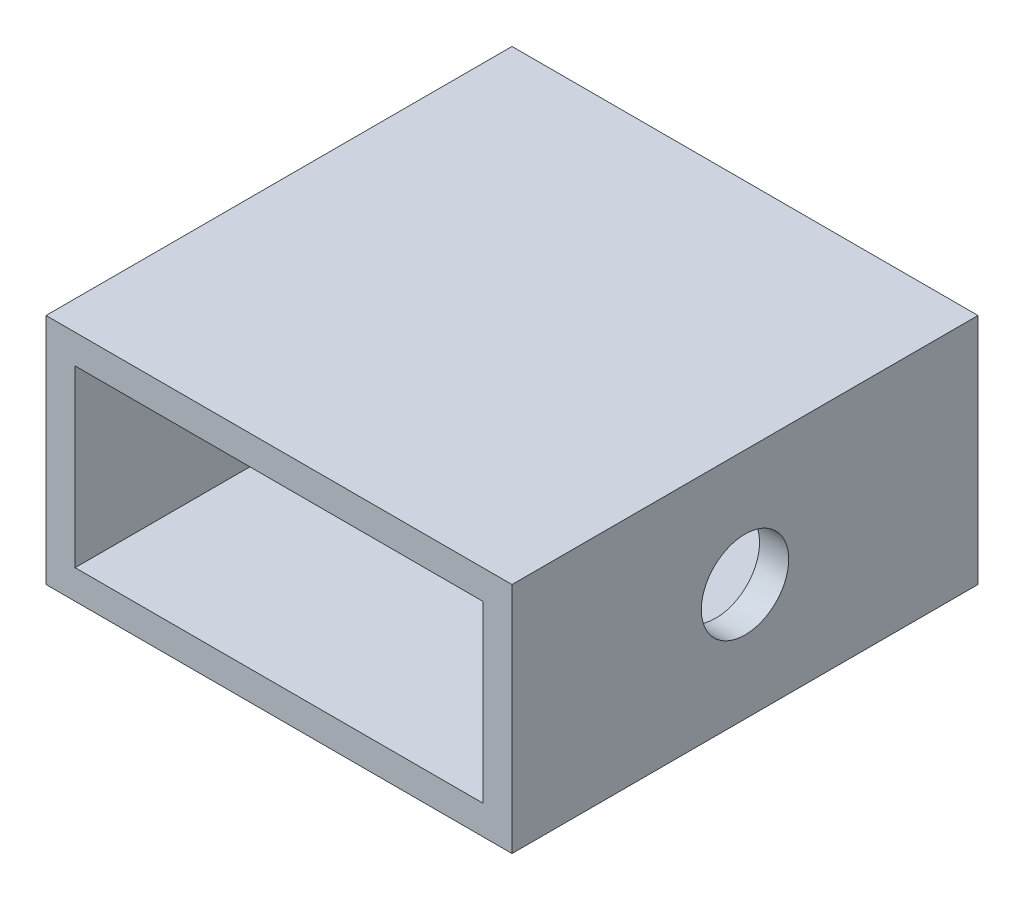
ISO-10303-21;
HEADER;
FILE_DESCRIPTION(('STEP AP214'),'2;1');
FILE_NAME('part.step','',(''),(''),'','','');
FILE_SCHEMA(('AUTOMOTIVE_DESIGN { 1 0 10303 214 1 1 1 1 }'));
ENDSEC;
DATA;
#1=APPLICATION_CONTEXT('core data for automotive mechanical design processes');
#2=APPLICATION_PROTOCOL_DEFINITION('international standard','automotive_design',2000,#1);
#3=PRODUCT_CONTEXT('',#1,'mechanical');
#4=PRODUCT('Part','Part','',(#3));
#5=PRODUCT_RELATED_PRODUCT_CATEGORY('part','',(#4));
#6=PRODUCT_DEFINITION_FORMATION('','',#4);
#7=PRODUCT_DEFINITION_CONTEXT('part definition',#1,'design');
#8=PRODUCT_DEFINITION('design','',#6,#7);
#9=PRODUCT_DEFINITION_SHAPE('','',#8);
#10=(LENGTH_UNIT() NAMED_UNIT(*) SI_UNIT(.MILLI.,.METRE.));
#11=(NAMED_UNIT(*) PLANE_ANGLE_UNIT() SI_UNIT($,.RADIAN.));
#12=(NAMED_UNIT(*) SI_UNIT($,.STERADIAN.) SOLID_ANGLE_UNIT());
#13=UNCERTAINTY_MEASURE_WITH_UNIT(LENGTH_MEASURE(1.E-05),#10,'distance_accuracy_value','');
#14=(GEOMETRIC_REPRESENTATION_CONTEXT(3) GLOBAL_UNCERTAINTY_ASSIGNED_CONTEXT((#13)) GLOBAL_UNIT_ASSIGNED_CONTEXT((#10,
#11,#12)) REPRESENTATION_CONTEXT('',''));
#15=CARTESIAN_POINT('',(0.,0.,0.));
#16=DIRECTION('',(0.,0.,1.));
#17=DIRECTION('',(1.,0.,0.));
#18=AXIS2_PLACEMENT_3D('',#15,#16,#17);
#19=CARTESIAN_POINT('',(0.,0.,50.8));
#20=DIRECTION('',(0.,0.,-1.));
#21=DIRECTION('',(-1.,0.,0.));
#22=AXIS2_PLACEMENT_3D('',#19,#20,#21);
#23=PLANE('',#22);
#24=DIRECTION('',(0.,1.,0.));
#25=VECTOR('',#24,1.);
#26=CARTESIAN_POINT('',(25.4,-12.7,50.8));
#27=LINE('',#26,#25);
#28=CARTESIAN_POINT('',(25.4,-12.7,50.8));
#29=VERTEX_POINT('',#28);
#30=CARTESIAN_POINT('',(25.4,12.7,50.8));
#31=VERTEX_POINT('',#30);
#32=EDGE_CURVE('E145',#29,#31,#27,.T.);
#33=ORIENTED_EDGE('',*,*,#32,.T.);
#34=DIRECTION('',(-1.,0.,0.));
#35=VECTOR('',#34,1.);
#36=CARTESIAN_POINT('',(-25.4,12.7,50.8));
#37=LINE('',#36,#35);
#38=CARTESIAN_POINT('',(-25.4,12.7,50.8));
#39=VERTEX_POINT('',#38);
#40=EDGE_CURVE('E148',#31,#39,#37,.T.);
#41=ORIENTED_EDGE('',*,*,#40,.T.);
#42=DIRECTION('',(0.,-1.,0.));
#43=VECTOR('',#42,1.);
#44=CARTESIAN_POINT('',(-25.4,-12.7,50.8));
#45=LINE('',#44,#43);
#46=CARTESIAN_POINT('',(-25.4,-12.7,50.8));
#47=VERTEX_POINT('',#46);
#48=EDGE_CURVE('E151',#39,#47,#45,.T.);
#49=ORIENTED_EDGE('',*,*,#48,.T.);
#50=DIRECTION('',(1.,0.,0.));
#51=VECTOR('',#50,1.);
#52=CARTESIAN_POINT('',(-25.4,-12.7,50.8));
#53=LINE('',#52,#51);
#54=EDGE_CURVE('E153',#47,#29,#53,.T.);
#55=ORIENTED_EDGE('',*,*,#54,.T.);
#56=EDGE_LOOP('',(#33,#41,#49,#55));
#57=FACE_BOUND('',#56,.T.);
#58=DIRECTION('',(0.,-1.,0.));
#59=VECTOR('',#58,1.);
#60=CARTESIAN_POINT('',(-22.225,-9.525,50.8));
#61=LINE('',#60,#59);
#62=CARTESIAN_POINT('',(-22.225,9.525,50.8));
#63=VERTEX_POINT('',#62);
#64=CARTESIAN_POINT('',(-22.225,-9.525,50.8));
#65=VERTEX_POINT('',#64);
#66=EDGE_CURVE('E103',#63,#65,#61,.T.);
#67=ORIENTED_EDGE('',*,*,#66,.F.);
#68=DIRECTION('',(-1.,0.,0.));
#69=VECTOR('',#68,1.);
#70=CARTESIAN_POINT('',(-22.225,9.525,50.8));
#71=LINE('',#70,#69);
#72=CARTESIAN_POINT('',(22.225,9.525,50.8));
#73=VERTEX_POINT('',#72);
#74=EDGE_CURVE('E126',#73,#63,#71,.T.);
#75=ORIENTED_EDGE('',*,*,#74,.F.);
#76=DIRECTION('',(0.,1.,0.));
#77=VECTOR('',#76,1.);
#78=CARTESIAN_POINT('',(22.225,-9.525,50.8));
#79=LINE('',#78,#77);
#80=CARTESIAN_POINT('',(22.225,-9.525,50.8));
#81=VERTEX_POINT('',#80);
#82=EDGE_CURVE('E124',#81,#73,#79,.T.);
#83=ORIENTED_EDGE('',*,*,#82,.F.);
#84=DIRECTION('',(1.,0.,0.));
#85=VECTOR('',#84,1.);
#86=CARTESIAN_POINT('',(-22.225,-9.525,50.8));
#87=LINE('',#86,#85);
#88=EDGE_CURVE('E111',#65,#81,#87,.T.);
#89=ORIENTED_EDGE('',*,*,#88,.F.);
#90=EDGE_LOOP('',(#67,#75,#83,#89));
#91=FACE_BOUND('',#90,.T.);
#92=ADVANCED_FACE('F36',(#57,#91),#23,.F.);
#93=CARTESIAN_POINT('',(0.,0.,0.));
#94=DIRECTION('',(0.,0.,-1.));
#95=DIRECTION('',(-1.,0.,0.));
#96=AXIS2_PLACEMENT_3D('',#93,#94,#95);
#97=PLANE('',#96);
#98=DIRECTION('',(0.,1.,0.));
#99=VECTOR('',#98,1.);
#100=CARTESIAN_POINT('',(25.4,-12.7,0.));
#101=LINE('',#100,#99);
#102=CARTESIAN_POINT('',(25.4,-12.7,0.));
#103=VERTEX_POINT('',#102);
#104=CARTESIAN_POINT('',(25.4,12.7,0.));
#105=VERTEX_POINT('',#104);
#106=EDGE_CURVE('E120',#103,#105,#101,.T.);
#107=ORIENTED_EDGE('',*,*,#106,.F.);
#108=DIRECTION('',(1.,0.,0.));
#109=VECTOR('',#108,1.);
#110=CARTESIAN_POINT('',(-25.4,-12.7,0.));
#111=LINE('',#110,#109);
#112=CARTESIAN_POINT('',(-25.4,-12.7,0.));
#113=VERTEX_POINT('',#112);
#114=EDGE_CURVE('E149',#113,#103,#111,.T.);
#115=ORIENTED_EDGE('',*,*,#114,.F.);
#116=DIRECTION('',(0.,-1.,0.));
#117=VECTOR('',#116,1.);
#118=CARTESIAN_POINT('',(-25.4,-12.7,0.));
#119=LINE('',#118,#117);
#120=CARTESIAN_POINT('',(-25.4,12.7,0.));
#121=VERTEX_POINT('',#120);
#122=EDGE_CURVE('E160',#121,#113,#119,.T.);
#123=ORIENTED_EDGE('',*,*,#122,.F.);
#124=DIRECTION('',(-1.,0.,0.));
#125=VECTOR('',#124,1.);
#126=CARTESIAN_POINT('',(-25.4,12.7,0.));
#127=LINE('',#126,#125);
#128=EDGE_CURVE('E158',#105,#121,#127,.T.);
#129=ORIENTED_EDGE('',*,*,#128,.F.);
#130=EDGE_LOOP('',(#107,#115,#123,#129));
#131=FACE_BOUND('',#130,.T.);
#132=DIRECTION('',(-1.,0.,0.));
#133=VECTOR('',#132,1.);
#134=CARTESIAN_POINT('',(-22.225,9.525,0.));
#135=LINE('',#134,#133);
#136=CARTESIAN_POINT('',(22.225,9.525,0.));
#137=VERTEX_POINT('',#136);
#138=CARTESIAN_POINT('',(-22.225,9.525,0.));
#139=VERTEX_POINT('',#138);
#140=EDGE_CURVE('E112',#137,#139,#135,.T.);
#141=ORIENTED_EDGE('',*,*,#140,.T.);
#142=DIRECTION('',(0.,-1.,0.));
#143=VECTOR('',#142,1.);
#144=CARTESIAN_POINT('',(-22.225,-9.525,0.));
#145=LINE('',#144,#143);
#146=CARTESIAN_POINT('',(-22.225,-9.525,0.));
#147=VERTEX_POINT('',#146);
#148=EDGE_CURVE('E60',#139,#147,#145,.T.);
#149=ORIENTED_EDGE('',*,*,#148,.T.);
#150=DIRECTION('',(1.,0.,0.));
#151=VECTOR('',#150,1.);
#152=CARTESIAN_POINT('',(-22.225,-9.525,0.));
#153=LINE('',#152,#151);
#154=CARTESIAN_POINT('',(22.225,-9.525,0.));
#155=VERTEX_POINT('',#154);
#156=EDGE_CURVE('E118',#147,#155,#153,.T.);
#157=ORIENTED_EDGE('',*,*,#156,.T.);
#158=DIRECTION('',(0.,1.,0.));
#159=VECTOR('',#158,1.);
#160=CARTESIAN_POINT('',(22.225,-9.525,0.));
#161=LINE('',#160,#159);
#162=EDGE_CURVE('E137',#155,#137,#161,.T.);
#163=ORIENTED_EDGE('',*,*,#162,.T.);
#164=EDGE_LOOP('',(#141,#149,#157,#163));
#165=FACE_BOUND('',#164,.T.);
#166=ADVANCED_FACE('F181',(#131,#165),#97,.T.);
#167=CARTESIAN_POINT('',(25.4,-12.7,50.8));
#168=DIRECTION('',(-1.,0.,0.));
#169=DIRECTION('',(0.,0.,1.));
#170=AXIS2_PLACEMENT_3D('',#167,#168,#169);
#171=PLANE('',#170);
#172=CARTESIAN_POINT('',(25.4,0.,25.4));
#173=DIRECTION('',(-1.,0.,0.));
#174=DIRECTION('',(0.,0.,1.));
#175=AXIS2_PLACEMENT_3D('',#172,#173,#174);
#176=CIRCLE('',#175,4.7625);
#177=CARTESIAN_POINT('',(25.4,0.,30.1625));
#178=VERTEX_POINT('',#177);
#179=EDGE_CURVE('E222',#178,#178,#176,.T.);
#180=ORIENTED_EDGE('',*,*,#179,.T.);
#181=EDGE_LOOP('',(#180));
#182=FACE_BOUND('',#181,.T.);
#183=ORIENTED_EDGE('',*,*,#106,.T.);
#184=DIRECTION('',(0.,0.,-1.));
#185=VECTOR('',#184,1.);
#186=CARTESIAN_POINT('',(25.4,12.7,50.8));
#187=LINE('',#186,#185);
#188=EDGE_CURVE('E11',#31,#105,#187,.T.);
#189=ORIENTED_EDGE('',*,*,#188,.F.);
#190=ORIENTED_EDGE('',*,*,#32,.F.);
#191=DIRECTION('',(0.,0.,-1.));
#192=VECTOR('',#191,1.);
#193=CARTESIAN_POINT('',(25.4,-12.7,50.8));
#194=LINE('',#193,#192);
#195=EDGE_CURVE('E155',#29,#103,#194,.T.);
#196=ORIENTED_EDGE('',*,*,#195,.T.);
#197=EDGE_LOOP('',(#183,#189,#190,#196));
#198=FACE_BOUND('',#197,.T.);
#199=ADVANCED_FACE('F38',(#182,#198),#171,.F.);
#200=CARTESIAN_POINT('',(-25.4,12.7,50.8));
#201=DIRECTION('',(0.,-1.,0.));
#202=DIRECTION('',(0.,0.,-1.));
#203=AXIS2_PLACEMENT_3D('',#200,#201,#202);
#204=PLANE('',#203);
#205=ORIENTED_EDGE('',*,*,#128,.T.);
#206=DIRECTION('',(0.,0.,-1.));
#207=VECTOR('',#206,1.);
#208=CARTESIAN_POINT('',(-25.4,12.7,50.8));
#209=LINE('',#208,#207);
#210=EDGE_CURVE('E45',#39,#121,#209,.T.);
#211=ORIENTED_EDGE('',*,*,#210,.F.);
#212=ORIENTED_EDGE('',*,*,#40,.F.);
#213=ORIENTED_EDGE('',*,*,#188,.T.);
#214=EDGE_LOOP('',(#205,#211,#212,#213));
#215=FACE_BOUND('',#214,.T.);
#216=ADVANCED_FACE('F191',(#215),#204,.F.);
#217=CARTESIAN_POINT('',(-25.4,-12.7,50.8));
#218=DIRECTION('',(1.,0.,0.));
#219=DIRECTION('',(0.,0.,-1.));
#220=AXIS2_PLACEMENT_3D('',#217,#218,#219);
#221=PLANE('',#220);
#222=CARTESIAN_POINT('',(-25.4,0.,25.4));
#223=DIRECTION('',(-1.,0.,0.));
#224=DIRECTION('',(0.,0.,1.));
#225=AXIS2_PLACEMENT_3D('',#222,#223,#224);
#226=CIRCLE('',#225,4.7625);
#227=CARTESIAN_POINT('',(-25.4,0.,30.1625));
#228=VERTEX_POINT('',#227);
#229=EDGE_CURVE('E224',#228,#228,#226,.T.);
#230=ORIENTED_EDGE('',*,*,#229,.F.);
#231=EDGE_LOOP('',(#230));
#232=FACE_BOUND('',#231,.T.);
#233=ORIENTED_EDGE('',*,*,#122,.T.);
#234=DIRECTION('',(0.,0.,-1.));
#235=VECTOR('',#234,1.);
#236=CARTESIAN_POINT('',(-25.4,-12.7,50.8));
#237=LINE('',#236,#235);
#238=EDGE_CURVE('E167',#47,#113,#237,.T.);
#239=ORIENTED_EDGE('',*,*,#238,.F.);
#240=ORIENTED_EDGE('',*,*,#48,.F.);
#241=ORIENTED_EDGE('',*,*,#210,.T.);
#242=EDGE_LOOP('',(#233,#239,#240,#241));
#243=FACE_BOUND('',#242,.T.);
#244=ADVANCED_FACE('F175',(#232,#243),#221,.F.);
#245=CARTESIAN_POINT('',(-25.4,-12.7,50.8));
#246=DIRECTION('',(0.,1.,0.));
#247=DIRECTION('',(0.,0.,1.));
#248=AXIS2_PLACEMENT_3D('',#245,#246,#247);
#249=PLANE('',#248);
#250=ORIENTED_EDGE('',*,*,#114,.T.);
#251=ORIENTED_EDGE('',*,*,#195,.F.);
#252=ORIENTED_EDGE('',*,*,#54,.F.);
#253=ORIENTED_EDGE('',*,*,#238,.T.);
#254=EDGE_LOOP('',(#250,#251,#252,#253));
#255=FACE_BOUND('',#254,.T.);
#256=ADVANCED_FACE('F185',(#255),#249,.F.);
#257=CARTESIAN_POINT('',(-22.225,-9.525,50.8));
#258=DIRECTION('',(1.,0.,0.));
#259=DIRECTION('',(0.,0.,-1.));
#260=AXIS2_PLACEMENT_3D('',#257,#258,#259);
#261=PLANE('',#260);
#262=CARTESIAN_POINT('',(-22.225,0.,25.4));
#263=DIRECTION('',(1.,0.,0.));
#264=DIRECTION('',(0.,0.,-1.));
#265=AXIS2_PLACEMENT_3D('',#262,#263,#264);
#266=CIRCLE('',#265,4.7625);
#267=CARTESIAN_POINT('',(-22.225,0.,20.6375));
#268=VERTEX_POINT('',#267);
#269=EDGE_CURVE('E134',#268,#268,#266,.T.);
#270=ORIENTED_EDGE('',*,*,#269,.F.);
#271=EDGE_LOOP('',(#270));
#272=FACE_BOUND('',#271,.T.);
#273=ORIENTED_EDGE('',*,*,#148,.F.);
#274=DIRECTION('',(0.,0.,-1.));
#275=VECTOR('',#274,1.);
#276=CARTESIAN_POINT('',(-22.225,9.525,50.8));
#277=LINE('',#276,#275);
#278=EDGE_CURVE('E107',#63,#139,#277,.T.);
#279=ORIENTED_EDGE('',*,*,#278,.F.);
#280=ORIENTED_EDGE('',*,*,#66,.T.);
#281=DIRECTION('',(0.,0.,-1.));
#282=VECTOR('',#281,1.);
#283=CARTESIAN_POINT('',(-22.225,-9.525,50.8));
#284=LINE('',#283,#282);
#285=EDGE_CURVE('E106',#65,#147,#284,.T.);
#286=ORIENTED_EDGE('',*,*,#285,.T.);
#287=EDGE_LOOP('',(#273,#279,#280,#286));
#288=FACE_BOUND('',#287,.T.);
#289=ADVANCED_FACE('F105',(#272,#288),#261,.T.);
#290=CARTESIAN_POINT('',(-22.225,-9.525,50.8));
#291=DIRECTION('',(0.,1.,0.));
#292=DIRECTION('',(0.,0.,1.));
#293=AXIS2_PLACEMENT_3D('',#290,#291,#292);
#294=PLANE('',#293);
#295=ORIENTED_EDGE('',*,*,#156,.F.);
#296=ORIENTED_EDGE('',*,*,#285,.F.);
#297=ORIENTED_EDGE('',*,*,#88,.T.);
#298=DIRECTION('',(0.,0.,-1.));
#299=VECTOR('',#298,1.);
#300=CARTESIAN_POINT('',(22.225,-9.525,50.8));
#301=LINE('',#300,#299);
#302=EDGE_CURVE('E121',#81,#155,#301,.T.);
#303=ORIENTED_EDGE('',*,*,#302,.T.);
#304=EDGE_LOOP('',(#295,#296,#297,#303));
#305=FACE_BOUND('',#304,.T.);
#306=ADVANCED_FACE('F115',(#305),#294,.T.);
#307=CARTESIAN_POINT('',(22.225,-9.525,50.8));
#308=DIRECTION('',(-1.,0.,0.));
#309=DIRECTION('',(0.,-1.,0.));
#310=AXIS2_PLACEMENT_3D('',#307,#308,#309);
#311=PLANE('',#310);
#312=CARTESIAN_POINT('',(22.225,0.,25.4));
#313=DIRECTION('',(-1.,0.,0.));
#314=DIRECTION('',(0.,-1.,0.));
#315=AXIS2_PLACEMENT_3D('',#312,#313,#314);
#316=CIRCLE('',#315,4.7625);
#317=CARTESIAN_POINT('',(22.225,-4.7625,25.4));
#318=VERTEX_POINT('',#317);
#319=EDGE_CURVE('E40',#318,#318,#316,.T.);
#320=ORIENTED_EDGE('',*,*,#319,.F.);
#321=EDGE_LOOP('',(#320));
#322=FACE_BOUND('',#321,.T.);
#323=ORIENTED_EDGE('',*,*,#162,.F.);
#324=ORIENTED_EDGE('',*,*,#302,.F.);
#325=ORIENTED_EDGE('',*,*,#82,.T.);
#326=DIRECTION('',(0.,0.,-1.));
#327=VECTOR('',#326,1.);
#328=CARTESIAN_POINT('',(22.225,9.525,50.8));
#329=LINE('',#328,#327);
#330=EDGE_CURVE('E52',#73,#137,#329,.T.);
#331=ORIENTED_EDGE('',*,*,#330,.T.);
#332=EDGE_LOOP('',(#323,#324,#325,#331));
#333=FACE_BOUND('',#332,.T.);
#334=ADVANCED_FACE('F217',(#322,#333),#311,.T.);
#335=CARTESIAN_POINT('',(-22.225,9.525,50.8));
#336=DIRECTION('',(0.,-1.,0.));
#337=DIRECTION('',(0.,0.,-1.));
#338=AXIS2_PLACEMENT_3D('',#335,#336,#337);
#339=PLANE('',#338);
#340=ORIENTED_EDGE('',*,*,#140,.F.);
#341=ORIENTED_EDGE('',*,*,#330,.F.);
#342=ORIENTED_EDGE('',*,*,#74,.T.);
#343=ORIENTED_EDGE('',*,*,#278,.T.);
#344=EDGE_LOOP('',(#340,#341,#342,#343));
#345=FACE_BOUND('',#344,.T.);
#346=ADVANCED_FACE('F233',(#345),#339,.T.);
#347=CARTESIAN_POINT('',(25.4,0.,25.4));
#348=DIRECTION('',(-1.,0.,0.));
#349=DIRECTION('',(0.,0.,1.));
#350=AXIS2_PLACEMENT_3D('',#347,#348,#349);
#351=CYLINDRICAL_SURFACE('',#350,4.7625);
#352=ORIENTED_EDGE('',*,*,#319,.T.);
#353=EDGE_LOOP('',(#352));
#354=FACE_BOUND('',#353,.T.);
#355=ORIENTED_EDGE('',*,*,#179,.F.);
#356=EDGE_LOOP('',(#355));
#357=FACE_BOUND('',#356,.T.);
#358=ADVANCED_FACE('F230',(#354,#357),#351,.F.);
#359=ORIENTED_EDGE('',*,*,#269,.T.);
#360=EDGE_LOOP('',(#359));
#361=FACE_BOUND('',#360,.T.);
#362=ORIENTED_EDGE('',*,*,#229,.T.);
#363=EDGE_LOOP('',(#362));
#364=FACE_BOUND('',#363,.T.);
#365=ADVANCED_FACE('F232',(#361,#364),#351,.F.);
#366=CLOSED_SHELL('',(#92,#166,#199,#216,#244,#256,#289,#306,#334,#346,#358,#365));
#367=MANIFOLD_SOLID_BREP('B2',#366);
#368=ADVANCED_BREP_SHAPE_REPRESENTATION('',(#18,#367),#14);
#369=SHAPE_DEFINITION_REPRESENTATION(#9,#368);
ENDSEC;
END-ISO-10303-21;
